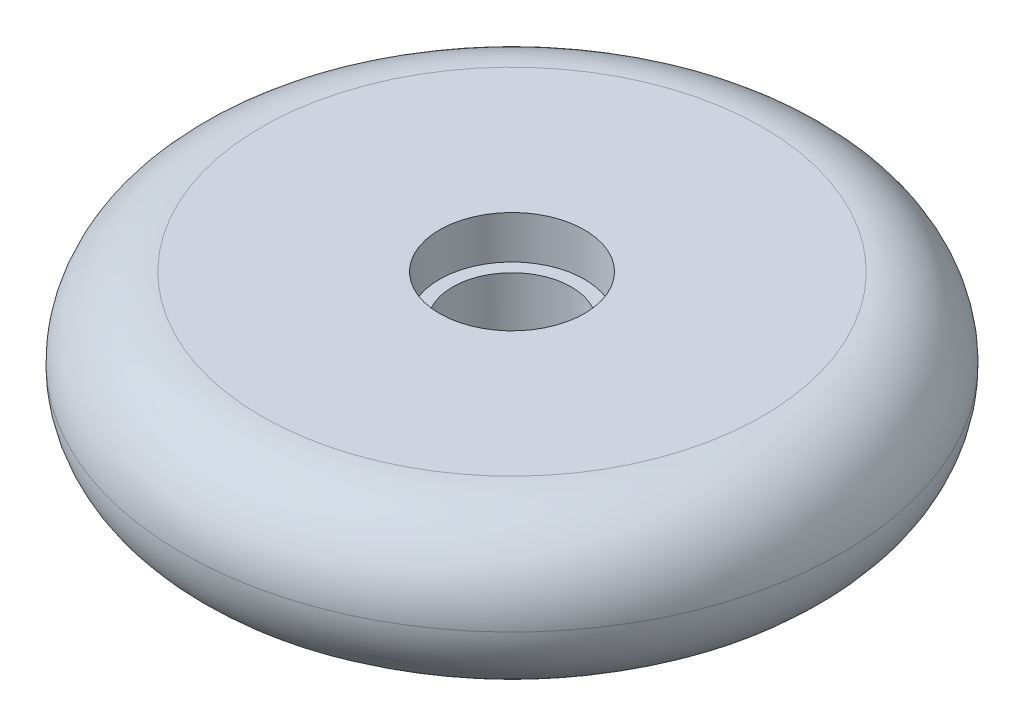
ISO-10303-21;
HEADER;
FILE_DESCRIPTION(('STEP AP214'),'2;1');
FILE_NAME('part.step','',(''),(''),'','','');
FILE_SCHEMA(('AUTOMOTIVE_DESIGN { 1 0 10303 214 1 1 1 1 }'));
ENDSEC;
DATA;
#1=APPLICATION_CONTEXT('core data for automotive mechanical design processes');
#2=APPLICATION_PROTOCOL_DEFINITION('international standard','automotive_design',2000,#1);
#3=PRODUCT_CONTEXT('',#1,'mechanical');
#4=PRODUCT('Part','Part','',(#3));
#5=PRODUCT_RELATED_PRODUCT_CATEGORY('part','',(#4));
#6=PRODUCT_DEFINITION_FORMATION('','',#4);
#7=PRODUCT_DEFINITION_CONTEXT('part definition',#1,'design');
#8=PRODUCT_DEFINITION('design','',#6,#7);
#9=PRODUCT_DEFINITION_SHAPE('','',#8);
#10=(LENGTH_UNIT() NAMED_UNIT(*) SI_UNIT(.MILLI.,.METRE.));
#11=(NAMED_UNIT(*) PLANE_ANGLE_UNIT() SI_UNIT($,.RADIAN.));
#12=(NAMED_UNIT(*) SI_UNIT($,.STERADIAN.) SOLID_ANGLE_UNIT());
#13=UNCERTAINTY_MEASURE_WITH_UNIT(LENGTH_MEASURE(1.E-05),#10,'distance_accuracy_value','');
#14=(GEOMETRIC_REPRESENTATION_CONTEXT(3) GLOBAL_UNCERTAINTY_ASSIGNED_CONTEXT((#13)) GLOBAL_UNIT_ASSIGNED_CONTEXT((#10,
#11,#12)) REPRESENTATION_CONTEXT('',''));
#15=CARTESIAN_POINT('',(0.,0.,0.));
#16=DIRECTION('',(0.,0.,1.));
#17=DIRECTION('',(1.,0.,0.));
#18=AXIS2_PLACEMENT_3D('',#15,#16,#17);
#19=CARTESIAN_POINT('',(0.,24.,0.));
#20=DIRECTION('',(0.,1.,0.));
#21=DIRECTION('',(0.,0.,1.));
#22=AXIS2_PLACEMENT_3D('',#19,#20,#21);
#23=PLANE('',#22);
#24=CARTESIAN_POINT('',(0.,24.,0.));
#25=DIRECTION('',(0.,1.,0.));
#26=DIRECTION('',(0.,0.,1.));
#27=AXIS2_PLACEMENT_3D('',#24,#25,#26);
#28=CIRCLE('',#27,11.);
#29=CARTESIAN_POINT('',(0.,24.,11.));
#30=VERTEX_POINT('',#29);
#31=EDGE_CURVE('E45',#30,#30,#28,.T.);
#32=ORIENTED_EDGE('',*,*,#31,.F.);
#33=EDGE_LOOP('',(#32));
#34=FACE_BOUND('',#33,.T.);
#35=CARTESIAN_POINT('',(0.,24.,0.));
#36=DIRECTION('',(0.,1.,0.));
#37=DIRECTION('',(0.,0.,1.));
#38=AXIS2_PLACEMENT_3D('',#35,#36,#37);
#39=CIRCLE('',#38,38.);
#40=CARTESIAN_POINT('',(0.,24.,38.));
#41=VERTEX_POINT('',#40);
#42=EDGE_CURVE('E10',#41,#41,#39,.T.);
#43=ORIENTED_EDGE('',*,*,#42,.T.);
#44=EDGE_LOOP('',(#43));
#45=FACE_BOUND('',#44,.T.);
#46=ADVANCED_FACE('F31',(#34,#45),#23,.T.);
#47=CARTESIAN_POINT('',(0.,0.,0.));
#48=DIRECTION('',(0.,1.,0.));
#49=DIRECTION('',(0.,0.,1.));
#50=AXIS2_PLACEMENT_3D('',#47,#48,#49);
#51=PLANE('',#50);
#52=CARTESIAN_POINT('',(0.,0.,0.));
#53=DIRECTION('',(0.,-1.,0.));
#54=DIRECTION('',(0.,0.,-1.));
#55=AXIS2_PLACEMENT_3D('',#52,#53,#54);
#56=CIRCLE('',#55,11.);
#57=CARTESIAN_POINT('',(0.,0.,-11.));
#58=VERTEX_POINT('',#57);
#59=EDGE_CURVE('E52',#58,#58,#56,.T.);
#60=ORIENTED_EDGE('',*,*,#59,.F.);
#61=EDGE_LOOP('',(#60));
#62=FACE_BOUND('',#61,.T.);
#63=CARTESIAN_POINT('',(0.,0.,0.));
#64=DIRECTION('',(0.,1.,0.));
#65=DIRECTION('',(0.,0.,1.));
#66=AXIS2_PLACEMENT_3D('',#63,#64,#65);
#67=CIRCLE('',#66,38.);
#68=CARTESIAN_POINT('',(0.,0.,38.));
#69=VERTEX_POINT('',#68);
#70=EDGE_CURVE('E39',#69,#69,#67,.F.);
#71=ORIENTED_EDGE('',*,*,#70,.T.);
#72=EDGE_LOOP('',(#71));
#73=FACE_BOUND('',#72,.T.);
#74=ADVANCED_FACE('F79',(#62,#73),#51,.F.);
#75=CARTESIAN_POINT('',(0.,12.,0.));
#76=DIRECTION('',(0.,1.,0.));
#77=DIRECTION('',(0.,0.,1.));
#78=AXIS2_PLACEMENT_3D('',#75,#76,#77);
#79=TOROIDAL_SURFACE('',#78,38.,12.);
#80=ORIENTED_EDGE('',*,*,#42,.F.);
#81=EDGE_LOOP('',(#80));
#82=FACE_BOUND('',#81,.T.);
#83=CARTESIAN_POINT('',(0.,12.,0.));
#84=DIRECTION('',(0.,1.,0.));
#85=DIRECTION('',(0.,0.,1.));
#86=AXIS2_PLACEMENT_3D('',#83,#84,#85);
#87=CIRCLE('',#86,50.);
#88=CARTESIAN_POINT('',(0.,12.,50.));
#89=VERTEX_POINT('',#88);
#90=EDGE_CURVE('E35',#89,#89,#87,.F.);
#91=ORIENTED_EDGE('',*,*,#90,.F.);
#92=EDGE_LOOP('',(#91));
#93=FACE_BOUND('',#92,.T.);
#94=ADVANCED_FACE('F33',(#82,#93),#79,.T.);
#95=CARTESIAN_POINT('',(0.,12.,0.));
#96=DIRECTION('',(0.,1.,0.));
#97=DIRECTION('',(0.,0.,1.));
#98=AXIS2_PLACEMENT_3D('',#95,#96,#97);
#99=TOROIDAL_SURFACE('',#98,38.,12.);
#100=ORIENTED_EDGE('',*,*,#70,.F.);
#101=EDGE_LOOP('',(#100));
#102=FACE_BOUND('',#101,.T.);
#103=ORIENTED_EDGE('',*,*,#90,.T.);
#104=EDGE_LOOP('',(#103));
#105=FACE_BOUND('',#104,.T.);
#106=ADVANCED_FACE('F85',(#102,#105),#99,.T.);
#107=CARTESIAN_POINT('',(0.,17.5,0.));
#108=DIRECTION('',(0.,1.,0.));
#109=DIRECTION('',(0.,0.,1.));
#110=AXIS2_PLACEMENT_3D('',#107,#108,#109);
#111=CYLINDRICAL_SURFACE('',#110,11.);
#112=CARTESIAN_POINT('',(0.,17.5,0.));
#113=DIRECTION('',(0.,1.,0.));
#114=DIRECTION('',(0.,0.,1.));
#115=AXIS2_PLACEMENT_3D('',#112,#113,#114);
#116=CIRCLE('',#115,11.);
#117=CARTESIAN_POINT('',(0.,17.5,11.));
#118=VERTEX_POINT('',#117);
#119=EDGE_CURVE('E48',#118,#118,#116,.T.);
#120=CARTESIAN_POINT('',(0.,17.5,11.));
#121=CARTESIAN_POINT('',(0.,17.5677083333333,11.));
#122=CARTESIAN_POINT('',(0.,17.6354166666667,11.));
#123=CARTESIAN_POINT('',(0.,17.7708333333333,11.));
#124=CARTESIAN_POINT('',(0.,17.8385416666667,11.));
#125=CARTESIAN_POINT('',(0.,17.9739583333333,11.));
#126=CARTESIAN_POINT('',(0.,18.0416666666667,11.));
#127=CARTESIAN_POINT('',(0.,18.1770833333333,11.));
#128=CARTESIAN_POINT('',(0.,18.2447916666667,11.));
#129=CARTESIAN_POINT('',(0.,18.3802083333333,11.));
#130=CARTESIAN_POINT('',(0.,18.4479166666667,11.));
#131=CARTESIAN_POINT('',(0.,18.5833333333333,11.));
#132=CARTESIAN_POINT('',(0.,18.6510416666667,11.));
#133=CARTESIAN_POINT('',(0.,18.7864583333333,11.));
#134=CARTESIAN_POINT('',(0.,18.8541666666667,11.));
#135=CARTESIAN_POINT('',(0.,18.9895833333333,11.));
#136=CARTESIAN_POINT('',(0.,19.0572916666667,11.));
#137=CARTESIAN_POINT('',(0.,19.1927083333333,11.));
#138=CARTESIAN_POINT('',(0.,19.2604166666667,11.));
#139=CARTESIAN_POINT('',(0.,19.3958333333333,11.));
#140=CARTESIAN_POINT('',(0.,19.4635416666667,11.));
#141=CARTESIAN_POINT('',(0.,19.5989583333333,11.));
#142=CARTESIAN_POINT('',(0.,19.6666666666667,11.));
#143=CARTESIAN_POINT('',(0.,19.8020833333333,11.));
#144=CARTESIAN_POINT('',(0.,19.8697916666667,11.));
#145=CARTESIAN_POINT('',(0.,20.0052083333333,11.));
#146=CARTESIAN_POINT('',(0.,20.0729166666667,11.));
#147=CARTESIAN_POINT('',(0.,20.2083333333333,11.));
#148=CARTESIAN_POINT('',(0.,20.2760416666667,11.));
#149=CARTESIAN_POINT('',(0.,20.4114583333333,11.));
#150=CARTESIAN_POINT('',(0.,20.4791666666667,11.));
#151=CARTESIAN_POINT('',(0.,20.6145833333333,11.));
#152=CARTESIAN_POINT('',(0.,20.6822916666667,11.));
#153=CARTESIAN_POINT('',(0.,20.8177083333333,11.));
#154=CARTESIAN_POINT('',(0.,20.8854166666667,11.));
#155=CARTESIAN_POINT('',(0.,21.0208333333333,11.));
#156=CARTESIAN_POINT('',(0.,21.0885416666667,11.));
#157=CARTESIAN_POINT('',(0.,21.2239583333333,11.));
#158=CARTESIAN_POINT('',(0.,21.2916666666667,11.));
#159=CARTESIAN_POINT('',(0.,21.4270833333333,11.));
#160=CARTESIAN_POINT('',(0.,21.4947916666667,11.));
#161=CARTESIAN_POINT('',(0.,21.6302083333333,11.));
#162=CARTESIAN_POINT('',(0.,21.6979166666667,11.));
#163=CARTESIAN_POINT('',(0.,21.8333333333333,11.));
#164=CARTESIAN_POINT('',(0.,21.9010416666667,11.));
#165=CARTESIAN_POINT('',(0.,22.0364583333333,11.));
#166=CARTESIAN_POINT('',(0.,22.1041666666667,11.));
#167=CARTESIAN_POINT('',(0.,22.2395833333333,11.));
#168=CARTESIAN_POINT('',(0.,22.3072916666667,11.));
#169=CARTESIAN_POINT('',(0.,22.4427083333333,11.));
#170=CARTESIAN_POINT('',(0.,22.5104166666667,11.));
#171=CARTESIAN_POINT('',(0.,22.6458333333333,11.));
#172=CARTESIAN_POINT('',(0.,22.7135416666667,11.));
#173=CARTESIAN_POINT('',(0.,22.8489583333333,11.));
#174=CARTESIAN_POINT('',(0.,22.9166666666667,11.));
#175=CARTESIAN_POINT('',(0.,23.0520833333333,11.));
#176=CARTESIAN_POINT('',(0.,23.1197916666667,11.));
#177=CARTESIAN_POINT('',(0.,23.2552083333333,11.));
#178=CARTESIAN_POINT('',(0.,23.3229166666667,11.));
#179=CARTESIAN_POINT('',(0.,23.4583333333333,11.));
#180=CARTESIAN_POINT('',(0.,23.5260416666667,11.));
#181=CARTESIAN_POINT('',(0.,23.6614583333333,11.));
#182=CARTESIAN_POINT('',(0.,23.7291666666667,11.));
#183=CARTESIAN_POINT('',(0.,23.8645833333333,11.));
#184=CARTESIAN_POINT('',(0.,23.9322916666667,11.));
#185=CARTESIAN_POINT('',(0.,24.,11.));
#186=B_SPLINE_CURVE_WITH_KNOTS('',3,(#120,#121,#122,#123,#124,#125,#126,#127,#128,#129,#130,
#131,#132,#133,#134,#135,#136,#137,#138,#139,#140,#141,#142,#143,#144,#145,#146,#147,#148,#149,
#150,#151,#152,#153,#154,#155,#156,#157,#158,#159,#160,#161,#162,#163,#164,#165,#166,#167,#168,
#169,#170,#171,#172,#173,#174,#175,#176,#177,#178,#179,#180,#181,#182,#183,#184,#185),
.UNSPECIFIED.,.F.,.F.,(4,2,2,2,2,2,2,2,2,2,2,2,2,2,2,2,2,2,2,2,2,2,2,2,2,2,2,2,2,2,2,2,4),(0.,
0.203125000000002,0.40625,0.609375000000002,0.812500000000001,1.015625,1.21875,1.421875,1.625,
1.828125,2.03125,2.234375,2.4375,2.640625,2.84375,3.046875,3.25,3.453125,3.65625,3.859375,
4.0625,4.265625,4.46875,4.671875,4.875,5.078125,5.28125,5.484375,5.6875,5.890625,6.09375,
6.296875,6.5),.UNSPECIFIED.);
#187=EDGE_CURVE('BSEAM88',#118,#30,#186,.T.);
#188=ORIENTED_EDGE('',*,*,#119,.F.);
#189=ORIENTED_EDGE('',*,*,#31,.T.);
#190=ORIENTED_EDGE('',*,*,#187,.T.);
#191=ORIENTED_EDGE('',*,*,#187,.F.);
#192=EDGE_LOOP('',(#188,#190,#189,#191));
#193=FACE_BOUND('',#192,.T.);
#194=ADVANCED_FACE('F88',(#193),#111,.F.);
#195=CARTESIAN_POINT('',(0.,17.5,0.));
#196=DIRECTION('',(0.,1.,0.));
#197=DIRECTION('',(0.,0.,1.));
#198=AXIS2_PLACEMENT_3D('',#195,#196,#197);
#199=PLANE('',#198);
#200=CARTESIAN_POINT('',(0.,17.5,0.));
#201=DIRECTION('',(0.,1.,0.));
#202=DIRECTION('',(0.,0.,1.));
#203=AXIS2_PLACEMENT_3D('',#200,#201,#202);
#204=CIRCLE('',#203,9.);
#205=CARTESIAN_POINT('',(0.,17.5,9.));
#206=VERTEX_POINT('',#205);
#207=EDGE_CURVE('E55',#206,#206,#204,.T.);
#208=ORIENTED_EDGE('',*,*,#207,.F.);
#209=EDGE_LOOP('',(#208));
#210=FACE_BOUND('',#209,.T.);
#211=ORIENTED_EDGE('',*,*,#119,.T.);
#212=EDGE_LOOP('',(#211));
#213=FACE_BOUND('',#212,.T.);
#214=ADVANCED_FACE('F75',(#210,#213),#199,.T.);
#215=CARTESIAN_POINT('',(0.,6.5,0.));
#216=DIRECTION('',(0.,-1.,0.));
#217=DIRECTION('',(0.,0.,-1.));
#218=AXIS2_PLACEMENT_3D('',#215,#216,#217);
#219=CYLINDRICAL_SURFACE('',#218,11.);
#220=CARTESIAN_POINT('',(0.,6.5,0.));
#221=DIRECTION('',(0.,-1.,0.));
#222=DIRECTION('',(0.,0.,-1.));
#223=AXIS2_PLACEMENT_3D('',#220,#221,#222);
#224=CIRCLE('',#223,11.);
#225=CARTESIAN_POINT('',(0.,6.5,-11.));
#226=VERTEX_POINT('',#225);
#227=EDGE_CURVE('E49',#226,#226,#224,.T.);
#228=CARTESIAN_POINT('',(0.,6.5,-11.));
#229=CARTESIAN_POINT('',(0.,6.43229166666667,-11.));
#230=CARTESIAN_POINT('',(0.,6.36458333333333,-11.));
#231=CARTESIAN_POINT('',(0.,6.22916666666667,-11.));
#232=CARTESIAN_POINT('',(0.,6.16145833333333,-11.));
#233=CARTESIAN_POINT('',(0.,6.02604166666667,-11.));
#234=CARTESIAN_POINT('',(0.,5.95833333333333,-11.));
#235=CARTESIAN_POINT('',(0.,5.82291666666667,-11.));
#236=CARTESIAN_POINT('',(0.,5.75520833333333,-11.));
#237=CARTESIAN_POINT('',(0.,5.61979166666667,-11.));
#238=CARTESIAN_POINT('',(0.,5.55208333333333,-11.));
#239=CARTESIAN_POINT('',(0.,5.41666666666667,-11.));
#240=CARTESIAN_POINT('',(0.,5.34895833333333,-11.));
#241=CARTESIAN_POINT('',(0.,5.21354166666667,-11.));
#242=CARTESIAN_POINT('',(0.,5.14583333333333,-11.));
#243=CARTESIAN_POINT('',(0.,5.01041666666667,-11.));
#244=CARTESIAN_POINT('',(0.,4.94270833333333,-11.));
#245=CARTESIAN_POINT('',(0.,4.80729166666667,-11.));
#246=CARTESIAN_POINT('',(0.,4.73958333333333,-11.));
#247=CARTESIAN_POINT('',(0.,4.60416666666667,-11.));
#248=CARTESIAN_POINT('',(0.,4.53645833333333,-11.));
#249=CARTESIAN_POINT('',(0.,4.40104166666667,-11.));
#250=CARTESIAN_POINT('',(0.,4.33333333333333,-11.));
#251=CARTESIAN_POINT('',(0.,4.19791666666667,-11.));
#252=CARTESIAN_POINT('',(0.,4.13020833333333,-11.));
#253=CARTESIAN_POINT('',(0.,3.99479166666667,-11.));
#254=CARTESIAN_POINT('',(0.,3.92708333333333,-11.));
#255=CARTESIAN_POINT('',(0.,3.79166666666667,-11.));
#256=CARTESIAN_POINT('',(0.,3.72395833333333,-11.));
#257=CARTESIAN_POINT('',(0.,3.58854166666667,-11.));
#258=CARTESIAN_POINT('',(0.,3.52083333333333,-11.));
#259=CARTESIAN_POINT('',(0.,3.38541666666667,-11.));
#260=CARTESIAN_POINT('',(0.,3.31770833333333,-11.));
#261=CARTESIAN_POINT('',(0.,3.18229166666667,-11.));
#262=CARTESIAN_POINT('',(0.,3.11458333333333,-11.));
#263=CARTESIAN_POINT('',(0.,2.97916666666667,-11.));
#264=CARTESIAN_POINT('',(0.,2.91145833333333,-11.));
#265=CARTESIAN_POINT('',(0.,2.77604166666667,-11.));
#266=CARTESIAN_POINT('',(0.,2.70833333333333,-11.));
#267=CARTESIAN_POINT('',(0.,2.57291666666667,-11.));
#268=CARTESIAN_POINT('',(0.,2.50520833333333,-11.));
#269=CARTESIAN_POINT('',(0.,2.36979166666667,-11.));
#270=CARTESIAN_POINT('',(0.,2.30208333333333,-11.));
#271=CARTESIAN_POINT('',(0.,2.16666666666667,-11.));
#272=CARTESIAN_POINT('',(0.,2.09895833333333,-11.));
#273=CARTESIAN_POINT('',(0.,1.96354166666667,-11.));
#274=CARTESIAN_POINT('',(0.,1.89583333333333,-11.));
#275=CARTESIAN_POINT('',(0.,1.76041666666667,-11.));
#276=CARTESIAN_POINT('',(0.,1.69270833333333,-11.));
#277=CARTESIAN_POINT('',(0.,1.55729166666667,-11.));
#278=CARTESIAN_POINT('',(0.,1.48958333333333,-11.));
#279=CARTESIAN_POINT('',(0.,1.35416666666667,-11.));
#280=CARTESIAN_POINT('',(0.,1.28645833333333,-11.));
#281=CARTESIAN_POINT('',(0.,1.15104166666667,-11.));
#282=CARTESIAN_POINT('',(0.,1.08333333333333,-11.));
#283=CARTESIAN_POINT('',(0.,0.947916666666667,-11.));
#284=CARTESIAN_POINT('',(0.,0.880208333333333,-11.));
#285=CARTESIAN_POINT('',(0.,0.744791666666667,-11.));
#286=CARTESIAN_POINT('',(0.,0.677083333333334,-11.));
#287=CARTESIAN_POINT('',(0.,0.541666666666667,-11.));
#288=CARTESIAN_POINT('',(0.,0.473958333333334,-11.));
#289=CARTESIAN_POINT('',(0.,0.338541666666667,-11.));
#290=CARTESIAN_POINT('',(0.,0.270833333333334,-11.));
#291=CARTESIAN_POINT('',(0.,0.135416666666667,-11.));
#292=CARTESIAN_POINT('',(0.,0.0677083333333333,-11.));
#293=CARTESIAN_POINT('',(0.,0.,-11.));
#294=B_SPLINE_CURVE_WITH_KNOTS('',3,(#228,#229,#230,#231,#232,#233,#234,#235,#236,#237,#238,
#239,#240,#241,#242,#243,#244,#245,#246,#247,#248,#249,#250,#251,#252,#253,#254,#255,#256,#257,
#258,#259,#260,#261,#262,#263,#264,#265,#266,#267,#268,#269,#270,#271,#272,#273,#274,#275,#276,
#277,#278,#279,#280,#281,#282,#283,#284,#285,#286,#287,#288,#289,#290,#291,#292,#293),
.UNSPECIFIED.,.F.,.F.,(4,2,2,2,2,2,2,2,2,2,2,2,2,2,2,2,2,2,2,2,2,2,2,2,2,2,2,2,2,2,2,2,4),(0.,
0.203125,0.40625,0.609375000000001,0.812500000000001,1.015625,1.21875,1.421875,1.625,1.828125,
2.03125,2.234375,2.4375,2.640625,2.84375,3.046875,3.25,3.453125,3.65625,3.859375,4.0625,
4.265625,4.46875,4.671875,4.875,5.078125,5.28125,5.484375,5.6875,5.890625,6.09375,6.296875,6.5),.UNSPECIFIED.);
#295=EDGE_CURVE('BSEAM69',#226,#58,#294,.T.);
#296=ORIENTED_EDGE('',*,*,#227,.F.);
#297=ORIENTED_EDGE('',*,*,#59,.T.);
#298=ORIENTED_EDGE('',*,*,#295,.T.);
#299=ORIENTED_EDGE('',*,*,#295,.F.);
#300=EDGE_LOOP('',(#296,#298,#297,#299));
#301=FACE_BOUND('',#300,.T.);
#302=ADVANCED_FACE('F69',(#301),#219,.F.);
#303=CARTESIAN_POINT('',(0.,6.5,0.));
#304=DIRECTION('',(0.,-1.,0.));
#305=DIRECTION('',(0.,0.,-1.));
#306=AXIS2_PLACEMENT_3D('',#303,#304,#305);
#307=PLANE('',#306);
#308=CARTESIAN_POINT('',(0.,6.5,0.));
#309=DIRECTION('',(0.,-1.,0.));
#310=DIRECTION('',(0.,0.,-1.));
#311=AXIS2_PLACEMENT_3D('',#308,#309,#310);
#312=CIRCLE('',#311,9.);
#313=CARTESIAN_POINT('',(0.,6.5,-9.));
#314=VERTEX_POINT('',#313);
#315=EDGE_CURVE('E60',#314,#314,#312,.T.);
#316=ORIENTED_EDGE('',*,*,#315,.F.);
#317=EDGE_LOOP('',(#316));
#318=FACE_BOUND('',#317,.T.);
#319=ORIENTED_EDGE('',*,*,#227,.T.);
#320=EDGE_LOOP('',(#319));
#321=FACE_BOUND('',#320,.T.);
#322=ADVANCED_FACE('F66',(#318,#321),#307,.T.);
#323=CARTESIAN_POINT('',(0.,24.,0.));
#324=DIRECTION('',(0.,-1.,0.));
#325=DIRECTION('',(0.,0.,-1.));
#326=AXIS2_PLACEMENT_3D('',#323,#324,#325);
#327=CYLINDRICAL_SURFACE('',#326,9.);
#328=ORIENTED_EDGE('',*,*,#207,.T.);
#329=EDGE_LOOP('',(#328));
#330=FACE_BOUND('',#329,.T.);
#331=ORIENTED_EDGE('',*,*,#315,.T.);
#332=EDGE_LOOP('',(#331));
#333=FACE_BOUND('',#332,.T.);
#334=ADVANCED_FACE('F64',(#330,#333),#327,.F.);
#335=CLOSED_SHELL('',(#46,#74,#94,#106,#194,#214,#302,#322,#334));
#336=MANIFOLD_SOLID_BREP('B2',#335);
#337=ADVANCED_BREP_SHAPE_REPRESENTATION('',(#18,#336),#14);
#338=SHAPE_DEFINITION_REPRESENTATION(#9,#337);
ENDSEC;
END-ISO-10303-21;
